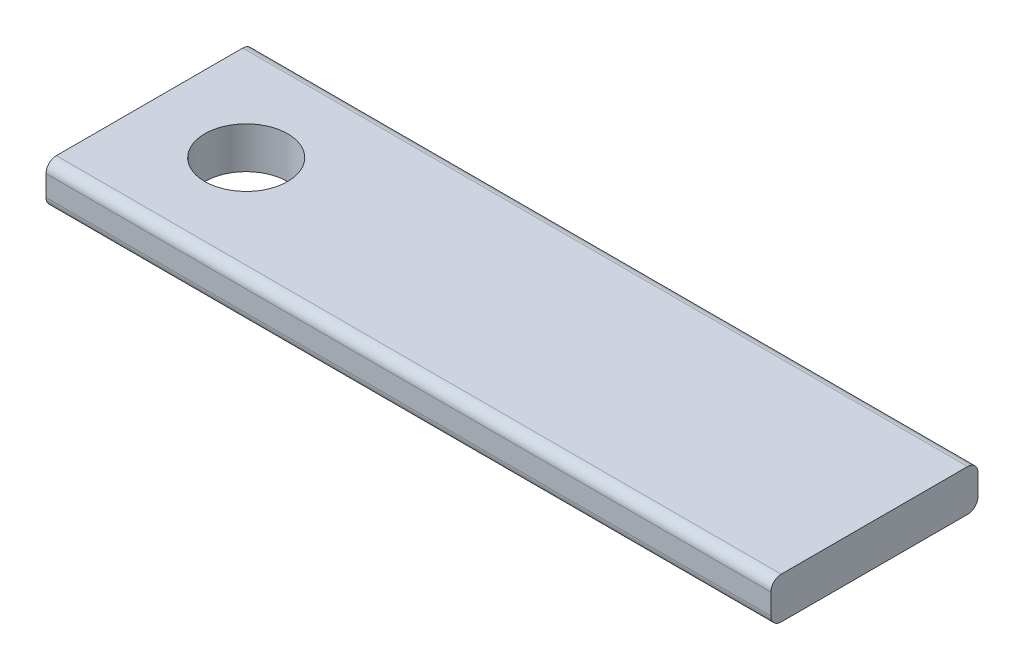
ISO-10303-21;
HEADER;
FILE_DESCRIPTION(('STEP AP214'),'2;1');
FILE_NAME('part.step','',(''),(''),'','','');
FILE_SCHEMA(('AUTOMOTIVE_DESIGN { 1 0 10303 214 1 1 1 1 }'));
ENDSEC;
DATA;
#1=APPLICATION_CONTEXT('core data for automotive mechanical design processes');
#2=APPLICATION_PROTOCOL_DEFINITION('international standard','automotive_design',2000,#1);
#3=PRODUCT_CONTEXT('',#1,'mechanical');
#4=PRODUCT('Part','Part','',(#3));
#5=PRODUCT_RELATED_PRODUCT_CATEGORY('part','',(#4));
#6=PRODUCT_DEFINITION_FORMATION('','',#4);
#7=PRODUCT_DEFINITION_CONTEXT('part definition',#1,'design');
#8=PRODUCT_DEFINITION('design','',#6,#7);
#9=PRODUCT_DEFINITION_SHAPE('','',#8);
#10=(LENGTH_UNIT() NAMED_UNIT(*) SI_UNIT(.MILLI.,.METRE.));
#11=(NAMED_UNIT(*) PLANE_ANGLE_UNIT() SI_UNIT($,.RADIAN.));
#12=(NAMED_UNIT(*) SI_UNIT($,.STERADIAN.) SOLID_ANGLE_UNIT());
#13=UNCERTAINTY_MEASURE_WITH_UNIT(LENGTH_MEASURE(1.E-05),#10,'distance_accuracy_value','');
#14=(GEOMETRIC_REPRESENTATION_CONTEXT(3) GLOBAL_UNCERTAINTY_ASSIGNED_CONTEXT((#13)) GLOBAL_UNIT_ASSIGNED_CONTEXT((#10,
#11,#12)) REPRESENTATION_CONTEXT('',''));
#15=CARTESIAN_POINT('',(0.,0.,0.));
#16=DIRECTION('',(0.,0.,1.));
#17=DIRECTION('',(1.,0.,0.));
#18=AXIS2_PLACEMENT_3D('',#15,#16,#17);
#19=CARTESIAN_POINT('',(26.25,1.5,7.5));
#20=DIRECTION('',(-1.,0.,0.));
#21=DIRECTION('',(0.,0.,1.));
#22=AXIS2_PLACEMENT_3D('',#19,#20,#21);
#23=PLANE('',#22);
#24=DIRECTION('',(0.,0.,-1.));
#25=VECTOR('',#24,1.);
#26=CARTESIAN_POINT('',(26.25,-1.5,7.5));
#27=LINE('',#26,#25);
#28=CARTESIAN_POINT('',(26.25,-1.5,6.75));
#29=VERTEX_POINT('',#28);
#30=CARTESIAN_POINT('',(26.25,-1.5,-6.75));
#31=VERTEX_POINT('',#30);
#32=EDGE_CURVE('E173',#29,#31,#27,.T.);
#33=ORIENTED_EDGE('',*,*,#32,.T.);
#34=CARTESIAN_POINT('',(26.25,-0.75,-6.75));
#35=DIRECTION('',(-1.,0.,0.));
#36=DIRECTION('',(0.,0.,1.));
#37=AXIS2_PLACEMENT_3D('',#34,#35,#36);
#38=CIRCLE('',#37,0.75);
#39=CARTESIAN_POINT('',(26.25,-0.75,-7.5));
#40=VERTEX_POINT('',#39);
#41=EDGE_CURVE('E147',#31,#40,#38,.F.);
#42=ORIENTED_EDGE('',*,*,#41,.T.);
#43=DIRECTION('',(0.,-1.,0.));
#44=VECTOR('',#43,1.);
#45=CARTESIAN_POINT('',(26.25,1.5,-7.5));
#46=LINE('',#45,#44);
#47=CARTESIAN_POINT('',(26.25,0.75,-7.5));
#48=VERTEX_POINT('',#47);
#49=EDGE_CURVE('E126',#48,#40,#46,.T.);
#50=ORIENTED_EDGE('',*,*,#49,.F.);
#51=CARTESIAN_POINT('',(26.25,0.75,-6.75));
#52=DIRECTION('',(-1.,0.,0.));
#53=DIRECTION('',(0.,0.,1.));
#54=AXIS2_PLACEMENT_3D('',#51,#52,#53);
#55=CIRCLE('',#54,0.75);
#56=CARTESIAN_POINT('',(26.25,1.5,-6.75));
#57=VERTEX_POINT('',#56);
#58=EDGE_CURVE('E131',#48,#57,#55,.F.);
#59=ORIENTED_EDGE('',*,*,#58,.T.);
#60=DIRECTION('',(0.,0.,-1.));
#61=VECTOR('',#60,1.);
#62=CARTESIAN_POINT('',(26.25,1.5,7.5));
#63=LINE('',#62,#61);
#64=CARTESIAN_POINT('',(26.25,1.5,6.75));
#65=VERTEX_POINT('',#64);
#66=EDGE_CURVE('E168',#65,#57,#63,.T.);
#67=ORIENTED_EDGE('',*,*,#66,.F.);
#68=CARTESIAN_POINT('',(26.25,0.75,6.75));
#69=DIRECTION('',(-1.,0.,0.));
#70=DIRECTION('',(0.,0.,1.));
#71=AXIS2_PLACEMENT_3D('',#68,#69,#70);
#72=CIRCLE('',#71,0.75);
#73=CARTESIAN_POINT('',(26.25,0.75,7.5));
#74=VERTEX_POINT('',#73);
#75=EDGE_CURVE('E61',#65,#74,#72,.F.);
#76=ORIENTED_EDGE('',*,*,#75,.T.);
#77=DIRECTION('',(0.,-1.,0.));
#78=VECTOR('',#77,1.);
#79=CARTESIAN_POINT('',(26.25,1.5,7.5));
#80=LINE('',#79,#78);
#81=CARTESIAN_POINT('',(26.25,-0.75,7.5));
#82=VERTEX_POINT('',#81);
#83=EDGE_CURVE('E158',#74,#82,#80,.T.);
#84=ORIENTED_EDGE('',*,*,#83,.T.);
#85=CARTESIAN_POINT('',(26.25,-0.75,6.75));
#86=DIRECTION('',(-1.,0.,0.));
#87=DIRECTION('',(0.,0.,1.));
#88=AXIS2_PLACEMENT_3D('',#85,#86,#87);
#89=CIRCLE('',#88,0.75);
#90=EDGE_CURVE('E54',#82,#29,#89,.F.);
#91=ORIENTED_EDGE('',*,*,#90,.T.);
#92=EDGE_LOOP('',(#33,#42,#50,#59,#67,#76,#84,#91));
#93=FACE_BOUND('',#92,.T.);
#94=ADVANCED_FACE('F39',(#93),#23,.F.);
#95=CARTESIAN_POINT('',(-26.25,1.5,-7.5));
#96=DIRECTION('',(0.,0.,1.));
#97=DIRECTION('',(1.,0.,0.));
#98=AXIS2_PLACEMENT_3D('',#95,#96,#97);
#99=PLANE('',#98);
#100=ORIENTED_EDGE('',*,*,#49,.T.);
#101=DIRECTION('',(-1.,0.,0.));
#102=VECTOR('',#101,1.);
#103=CARTESIAN_POINT('',(-26.25,-0.75,-7.5));
#104=LINE('',#103,#102);
#105=CARTESIAN_POINT('',(-26.25,-0.75,-7.5));
#106=VERTEX_POINT('',#105);
#107=EDGE_CURVE('E125',#40,#106,#104,.T.);
#108=ORIENTED_EDGE('',*,*,#107,.T.);
#109=DIRECTION('',(0.,-1.,0.));
#110=VECTOR('',#109,1.);
#111=CARTESIAN_POINT('',(-26.25,1.5,-7.5));
#112=LINE('',#111,#110);
#113=CARTESIAN_POINT('',(-26.25,0.75,-7.5));
#114=VERTEX_POINT('',#113);
#115=EDGE_CURVE('E108',#114,#106,#112,.T.);
#116=ORIENTED_EDGE('',*,*,#115,.F.);
#117=DIRECTION('',(-1.,0.,0.));
#118=VECTOR('',#117,1.);
#119=CARTESIAN_POINT('',(-26.25,0.75,-7.5));
#120=LINE('',#119,#118);
#121=EDGE_CURVE('E122',#114,#48,#120,.F.);
#122=ORIENTED_EDGE('',*,*,#121,.T.);
#123=EDGE_LOOP('',(#100,#108,#116,#122));
#124=FACE_BOUND('',#123,.T.);
#125=ADVANCED_FACE('F121',(#124),#99,.F.);
#126=CARTESIAN_POINT('',(-26.25,1.5,7.5));
#127=DIRECTION('',(1.,0.,0.));
#128=DIRECTION('',(0.,0.,-1.));
#129=AXIS2_PLACEMENT_3D('',#126,#127,#128);
#130=PLANE('',#129);
#131=ORIENTED_EDGE('',*,*,#115,.T.);
#132=CARTESIAN_POINT('',(-26.25,-0.75,-6.75));
#133=DIRECTION('',(1.,0.,0.));
#134=DIRECTION('',(0.,0.,-1.));
#135=AXIS2_PLACEMENT_3D('',#132,#133,#134);
#136=CIRCLE('',#135,0.75);
#137=CARTESIAN_POINT('',(-26.25,-1.5,-6.75));
#138=VERTEX_POINT('',#137);
#139=EDGE_CURVE('E115',#106,#138,#136,.F.);
#140=ORIENTED_EDGE('',*,*,#139,.T.);
#141=DIRECTION('',(0.,0.,1.));
#142=VECTOR('',#141,1.);
#143=CARTESIAN_POINT('',(-26.25,-1.5,7.5));
#144=LINE('',#143,#142);
#145=CARTESIAN_POINT('',(-26.25,-1.5,6.75));
#146=VERTEX_POINT('',#145);
#147=EDGE_CURVE('E170',#138,#146,#144,.T.);
#148=ORIENTED_EDGE('',*,*,#147,.T.);
#149=CARTESIAN_POINT('',(-26.25,-0.75,6.75));
#150=DIRECTION('',(1.,0.,0.));
#151=DIRECTION('',(0.,0.,-1.));
#152=AXIS2_PLACEMENT_3D('',#149,#150,#151);
#153=CIRCLE('',#152,0.75);
#154=CARTESIAN_POINT('',(-26.25,-0.75,7.5));
#155=VERTEX_POINT('',#154);
#156=EDGE_CURVE('E116',#146,#155,#153,.F.);
#157=ORIENTED_EDGE('',*,*,#156,.T.);
#158=DIRECTION('',(0.,-1.,0.));
#159=VECTOR('',#158,1.);
#160=CARTESIAN_POINT('',(-26.25,1.5,7.5));
#161=LINE('',#160,#159);
#162=CARTESIAN_POINT('',(-26.25,0.75,7.5));
#163=VERTEX_POINT('',#162);
#164=EDGE_CURVE('E127',#163,#155,#161,.T.);
#165=ORIENTED_EDGE('',*,*,#164,.F.);
#166=CARTESIAN_POINT('',(-26.25,0.75,6.75));
#167=DIRECTION('',(1.,0.,0.));
#168=DIRECTION('',(0.,0.,-1.));
#169=AXIS2_PLACEMENT_3D('',#166,#167,#168);
#170=CIRCLE('',#169,0.75);
#171=CARTESIAN_POINT('',(-26.25,1.5,6.75));
#172=VERTEX_POINT('',#171);
#173=EDGE_CURVE('E133',#163,#172,#170,.F.);
#174=ORIENTED_EDGE('',*,*,#173,.T.);
#175=DIRECTION('',(0.,0.,1.));
#176=VECTOR('',#175,1.);
#177=CARTESIAN_POINT('',(-26.25,1.5,7.5));
#178=LINE('',#177,#176);
#179=CARTESIAN_POINT('',(-26.25,1.5,-6.75));
#180=VERTEX_POINT('',#179);
#181=EDGE_CURVE('E110',#180,#172,#178,.T.);
#182=ORIENTED_EDGE('',*,*,#181,.F.);
#183=CARTESIAN_POINT('',(-26.25,0.75,-6.75));
#184=DIRECTION('',(1.,0.,0.));
#185=DIRECTION('',(0.,0.,-1.));
#186=AXIS2_PLACEMENT_3D('',#183,#184,#185);
#187=CIRCLE('',#186,0.75);
#188=EDGE_CURVE('E105',#180,#114,#187,.F.);
#189=ORIENTED_EDGE('',*,*,#188,.T.);
#190=EDGE_LOOP('',(#131,#140,#148,#157,#165,#174,#182,#189));
#191=FACE_BOUND('',#190,.T.);
#192=ADVANCED_FACE('F107',(#191),#130,.F.);
#193=CARTESIAN_POINT('',(-26.25,1.5,7.5));
#194=DIRECTION('',(0.,0.,-1.));
#195=DIRECTION('',(-1.,0.,0.));
#196=AXIS2_PLACEMENT_3D('',#193,#194,#195);
#197=PLANE('',#196);
#198=ORIENTED_EDGE('',*,*,#164,.T.);
#199=DIRECTION('',(1.,0.,0.));
#200=VECTOR('',#199,1.);
#201=CARTESIAN_POINT('',(26.25,-0.75,7.5));
#202=LINE('',#201,#200);
#203=EDGE_CURVE('E11',#155,#82,#202,.T.);
#204=ORIENTED_EDGE('',*,*,#203,.T.);
#205=ORIENTED_EDGE('',*,*,#83,.F.);
#206=DIRECTION('',(1.,0.,0.));
#207=VECTOR('',#206,1.);
#208=CARTESIAN_POINT('',(-26.25,0.75,7.5));
#209=LINE('',#208,#207);
#210=EDGE_CURVE('E47',#74,#163,#209,.F.);
#211=ORIENTED_EDGE('',*,*,#210,.T.);
#212=EDGE_LOOP('',(#198,#204,#205,#211));
#213=FACE_BOUND('',#212,.T.);
#214=ADVANCED_FACE('F157',(#213),#197,.F.);
#215=CARTESIAN_POINT('',(0.,1.5,0.));
#216=DIRECTION('',(0.,-1.,0.));
#217=DIRECTION('',(0.,0.,-1.));
#218=AXIS2_PLACEMENT_3D('',#215,#216,#217);
#219=PLANE('',#218);
#220=CARTESIAN_POINT('',(-19.25,1.5,0.));
#221=DIRECTION('',(0.,1.,0.));
#222=DIRECTION('',(0.,0.,1.));
#223=AXIS2_PLACEMENT_3D('',#220,#221,#222);
#224=CIRCLE('',#223,3.);
#225=CARTESIAN_POINT('',(-19.25,1.5,3.));
#226=VERTEX_POINT('',#225);
#227=EDGE_CURVE('E176',#226,#226,#224,.T.);
#228=ORIENTED_EDGE('',*,*,#227,.F.);
#229=EDGE_LOOP('',(#228));
#230=FACE_BOUND('',#229,.T.);
#231=ORIENTED_EDGE('',*,*,#66,.T.);
#232=DIRECTION('',(-1.,0.,0.));
#233=VECTOR('',#232,1.);
#234=CARTESIAN_POINT('',(0.,1.5,-6.75));
#235=LINE('',#234,#233);
#236=EDGE_CURVE('E152',#57,#180,#235,.T.);
#237=ORIENTED_EDGE('',*,*,#236,.T.);
#238=ORIENTED_EDGE('',*,*,#181,.T.);
#239=DIRECTION('',(1.,0.,0.));
#240=VECTOR('',#239,1.);
#241=CARTESIAN_POINT('',(0.,1.5,6.75));
#242=LINE('',#241,#240);
#243=EDGE_CURVE('E149',#172,#65,#242,.T.);
#244=ORIENTED_EDGE('',*,*,#243,.T.);
#245=EDGE_LOOP('',(#231,#237,#238,#244));
#246=FACE_BOUND('',#245,.T.);
#247=ADVANCED_FACE('F167',(#230,#246),#219,.F.);
#248=CARTESIAN_POINT('',(0.,-1.5,0.));
#249=DIRECTION('',(0.,-1.,0.));
#250=DIRECTION('',(0.,0.,-1.));
#251=AXIS2_PLACEMENT_3D('',#248,#249,#250);
#252=PLANE('',#251);
#253=CARTESIAN_POINT('',(-19.25,-1.5,0.));
#254=DIRECTION('',(0.,1.,0.));
#255=DIRECTION('',(0.,0.,1.));
#256=AXIS2_PLACEMENT_3D('',#253,#254,#255);
#257=CIRCLE('',#256,3.);
#258=CARTESIAN_POINT('',(-19.25,-1.5,3.));
#259=VERTEX_POINT('',#258);
#260=EDGE_CURVE('E179',#259,#259,#257,.T.);
#261=ORIENTED_EDGE('',*,*,#260,.T.);
#262=EDGE_LOOP('',(#261));
#263=FACE_BOUND('',#262,.T.);
#264=ORIENTED_EDGE('',*,*,#147,.F.);
#265=DIRECTION('',(-1.,0.,0.));
#266=VECTOR('',#265,1.);
#267=CARTESIAN_POINT('',(26.25,-1.5,-6.75));
#268=LINE('',#267,#266);
#269=EDGE_CURVE('E142',#138,#31,#268,.F.);
#270=ORIENTED_EDGE('',*,*,#269,.T.);
#271=ORIENTED_EDGE('',*,*,#32,.F.);
#272=DIRECTION('',(1.,0.,0.));
#273=VECTOR('',#272,1.);
#274=CARTESIAN_POINT('',(-26.25,-1.5,6.75));
#275=LINE('',#274,#273);
#276=EDGE_CURVE('E140',#29,#146,#275,.F.);
#277=ORIENTED_EDGE('',*,*,#276,.T.);
#278=EDGE_LOOP('',(#264,#270,#271,#277));
#279=FACE_BOUND('',#278,.T.);
#280=ADVANCED_FACE('F185',(#263,#279),#252,.T.);
#281=CARTESIAN_POINT('',(-26.25,-0.75,-6.75));
#282=DIRECTION('',(1.,0.,0.));
#283=DIRECTION('',(0.,0.,-1.));
#284=AXIS2_PLACEMENT_3D('',#281,#282,#283);
#285=CYLINDRICAL_SURFACE('',#284,0.75);
#286=ORIENTED_EDGE('',*,*,#41,.F.);
#287=ORIENTED_EDGE('',*,*,#269,.F.);
#288=ORIENTED_EDGE('',*,*,#139,.F.);
#289=ORIENTED_EDGE('',*,*,#107,.F.);
#290=EDGE_LOOP('',(#286,#287,#288,#289));
#291=FACE_BOUND('',#290,.T.);
#292=ADVANCED_FACE('F194',(#291),#285,.T.);
#293=CARTESIAN_POINT('',(0.,0.75,-6.75));
#294=DIRECTION('',(-1.,0.,0.));
#295=DIRECTION('',(0.,0.,1.));
#296=AXIS2_PLACEMENT_3D('',#293,#294,#295);
#297=CYLINDRICAL_SURFACE('',#296,0.75);
#298=ORIENTED_EDGE('',*,*,#58,.F.);
#299=ORIENTED_EDGE('',*,*,#121,.F.);
#300=ORIENTED_EDGE('',*,*,#188,.F.);
#301=ORIENTED_EDGE('',*,*,#236,.F.);
#302=EDGE_LOOP('',(#298,#299,#300,#301));
#303=FACE_BOUND('',#302,.T.);
#304=ADVANCED_FACE('F130',(#303),#297,.T.);
#305=CARTESIAN_POINT('',(-26.25,-0.75,6.75));
#306=DIRECTION('',(-1.,0.,0.));
#307=DIRECTION('',(0.,0.,1.));
#308=AXIS2_PLACEMENT_3D('',#305,#306,#307);
#309=CYLINDRICAL_SURFACE('',#308,0.75);
#310=ORIENTED_EDGE('',*,*,#156,.F.);
#311=ORIENTED_EDGE('',*,*,#276,.F.);
#312=ORIENTED_EDGE('',*,*,#90,.F.);
#313=ORIENTED_EDGE('',*,*,#203,.F.);
#314=EDGE_LOOP('',(#310,#311,#312,#313));
#315=FACE_BOUND('',#314,.T.);
#316=ADVANCED_FACE('F187',(#315),#309,.T.);
#317=CARTESIAN_POINT('',(0.,0.75,6.75));
#318=DIRECTION('',(1.,0.,0.));
#319=DIRECTION('',(0.,0.,-1.));
#320=AXIS2_PLACEMENT_3D('',#317,#318,#319);
#321=CYLINDRICAL_SURFACE('',#320,0.75);
#322=ORIENTED_EDGE('',*,*,#173,.F.);
#323=ORIENTED_EDGE('',*,*,#210,.F.);
#324=ORIENTED_EDGE('',*,*,#75,.F.);
#325=ORIENTED_EDGE('',*,*,#243,.F.);
#326=EDGE_LOOP('',(#322,#323,#324,#325));
#327=FACE_BOUND('',#326,.T.);
#328=ADVANCED_FACE('F41',(#327),#321,.T.);
#329=CARTESIAN_POINT('',(-19.25,-1.5,0.));
#330=DIRECTION('',(0.,1.,0.));
#331=DIRECTION('',(0.,0.,1.));
#332=AXIS2_PLACEMENT_3D('',#329,#330,#331);
#333=CYLINDRICAL_SURFACE('',#332,3.);
#334=ORIENTED_EDGE('',*,*,#260,.F.);
#335=EDGE_LOOP('',(#334));
#336=FACE_BOUND('',#335,.T.);
#337=ORIENTED_EDGE('',*,*,#227,.T.);
#338=EDGE_LOOP('',(#337));
#339=FACE_BOUND('',#338,.T.);
#340=ADVANCED_FACE('F193',(#336,#339),#333,.F.);
#341=CLOSED_SHELL('',(#94,#125,#192,#214,#247,#280,#292,#304,#316,#328,#340));
#342=MANIFOLD_SOLID_BREP('B2',#341);
#343=ADVANCED_BREP_SHAPE_REPRESENTATION('',(#18,#342),#14);
#344=SHAPE_DEFINITION_REPRESENTATION(#9,#343);
ENDSEC;
END-ISO-10303-21;
